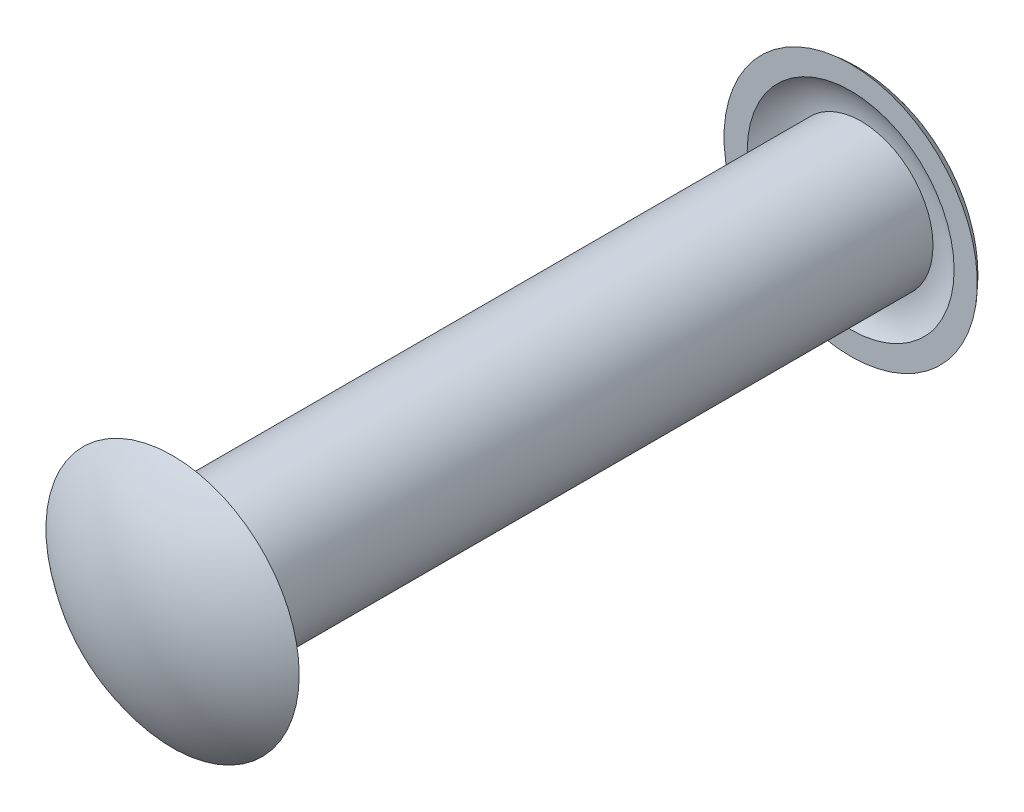
ISO-10303-21;
HEADER;
FILE_DESCRIPTION(('STEP AP214'),'2;1');
FILE_NAME('part.step','',(''),(''),'','','');
FILE_SCHEMA(('AUTOMOTIVE_DESIGN { 1 0 10303 214 1 1 1 1 }'));
ENDSEC;
DATA;
#1=APPLICATION_CONTEXT('core data for automotive mechanical design processes');
#2=APPLICATION_PROTOCOL_DEFINITION('international standard','automotive_design',2000,#1);
#3=PRODUCT_CONTEXT('',#1,'mechanical');
#4=PRODUCT('Part','Part','',(#3));
#5=PRODUCT_RELATED_PRODUCT_CATEGORY('part','',(#4));
#6=PRODUCT_DEFINITION_FORMATION('','',#4);
#7=PRODUCT_DEFINITION_CONTEXT('part definition',#1,'design');
#8=PRODUCT_DEFINITION('design','',#6,#7);
#9=PRODUCT_DEFINITION_SHAPE('','',#8);
#10=(LENGTH_UNIT() NAMED_UNIT(*) SI_UNIT(.MILLI.,.METRE.));
#11=(NAMED_UNIT(*) PLANE_ANGLE_UNIT() SI_UNIT($,.RADIAN.));
#12=(NAMED_UNIT(*) SI_UNIT($,.STERADIAN.) SOLID_ANGLE_UNIT());
#13=UNCERTAINTY_MEASURE_WITH_UNIT(LENGTH_MEASURE(1.E-05),#10,'distance_accuracy_value','');
#14=(GEOMETRIC_REPRESENTATION_CONTEXT(3) GLOBAL_UNCERTAINTY_ASSIGNED_CONTEXT((#13)) GLOBAL_UNIT_ASSIGNED_CONTEXT((#10,
#11,#12)) REPRESENTATION_CONTEXT('',''));
#15=CARTESIAN_POINT('',(0.,0.,0.));
#16=DIRECTION('',(0.,0.,1.));
#17=DIRECTION('',(1.,0.,0.));
#18=AXIS2_PLACEMENT_3D('',#15,#16,#17);
#19=CARTESIAN_POINT('',(0.,0.,0.));
#20=DIRECTION('',(0.,0.,-1.));
#21=DIRECTION('',(0.,1.,0.));
#22=AXIS2_PLACEMENT_3D('',#19,#20,#21);
#23=CONICAL_SURFACE('',#22,0.,0.785398163397349);
#24=CARTESIAN_POINT('',(0.,1.08528637465799E-13,-1.08590399999988));
#25=DIRECTION('',(0.,0.,1.));
#26=DIRECTION('',(0.,-1.,0.));
#27=AXIS2_PLACEMENT_3D('',#24,#25,#26);
#28=CIRCLE('',#27,1.08590399999969);
#29=CARTESIAN_POINT('',(0.,-1.08590399999958,-1.08590399999996));
#30=VERTEX_POINT('',#29);
#31=EDGE_CURVE('E69',#30,#30,#28,.T.);
#32=ORIENTED_EDGE('',*,*,#31,.F.);
#33=EDGE_LOOP('',(#32));
#34=FACE_BOUND('',#33,.T.);
#35=CARTESIAN_POINT('',(0.,0.,0.));
#36=VERTEX_POINT('',#35);
#37=VERTEX_LOOP('',#36);
#38=FACE_BOUND('',#37,.T.);
#39=ADVANCED_FACE('F17',(#34,#38),#23,.F.);
#40=CARTESIAN_POINT('',(0.,1.08528637465799E-13,-1.08590399999988));
#41=DIRECTION('',(0.,0.,-1.));
#42=DIRECTION('',(0.,1.,0.));
#43=AXIS2_PLACEMENT_3D('',#40,#41,#42);
#44=CYLINDRICAL_SURFACE('',#43,1.08590399999969);
#45=ORIENTED_EDGE('',*,*,#31,.T.);
#46=EDGE_LOOP('',(#45));
#47=FACE_BOUND('',#46,.T.);
#48=CARTESIAN_POINT('',(0.,3.13984949151802E-13,-3.45728575391386));
#49=DIRECTION('',(0.,0.,1.));
#50=DIRECTION('',(0.,-1.,0.));
#51=AXIS2_PLACEMENT_3D('',#48,#49,#50);
#52=CIRCLE('',#51,1.08590399999948);
#53=CARTESIAN_POINT('',(0.,1.0859039999998,-3.4572857539138));
#54=VERTEX_POINT('',#53);
#55=EDGE_CURVE('E66',#54,#54,#52,.T.);
#56=ORIENTED_EDGE('',*,*,#55,.F.);
#57=EDGE_LOOP('',(#56));
#58=FACE_BOUND('',#57,.T.);
#59=ADVANCED_FACE('F30',(#47,#58),#44,.F.);
#60=CARTESIAN_POINT('',(0.,1.0859039999998,-3.4572857539138));
#61=CARTESIAN_POINT('',(0.,2.13901754146935,-3.82043926275747));
#62=CARTESIAN_POINT('',(0.,2.82,-2.9554104803391));
#63=CARTESIAN_POINT('',(-1.88084090014134,1.08590399999976,-3.4572857539138));
#64=CARTESIAN_POINT('',(-3.70488706010556,2.1390175414694,-3.82043926275747));
#65=CARTESIAN_POINT('',(-4.8843832773438,2.82,-2.9554104803392));
#66=CARTESIAN_POINT('',(-0.94042045007067,-0.54295199999943,-3.4572857539139));
#67=CARTESIAN_POINT('',(-1.85244353005278,-1.06950877073419,-3.82043926275783));
#68=CARTESIAN_POINT('',(-2.4421916386719,-1.4099999999996,-2.9554104803395));
#69=CARTESIAN_POINT('',(0.,-2.1718079999986,-3.457285753914));
#70=CARTESIAN_POINT('',(0.,-4.27803508293773,-3.82043926275796));
#71=CARTESIAN_POINT('',(0.,-5.6399999999992,-2.9554104803398));
#72=CARTESIAN_POINT('',(0.94042045007067,-0.54295199999943,-3.4572857539139));
#73=CARTESIAN_POINT('',(1.85244353005278,-1.0695087707342,-3.82043926275783));
#74=CARTESIAN_POINT('',(2.4421916386719,-1.4099999999996,-2.9554104803395));
#75=CARTESIAN_POINT('',(1.88084090014134,1.08590399999976,-3.4572857539138));
#76=CARTESIAN_POINT('',(3.70488706010556,2.13901754146938,-3.82043926275747));
#77=CARTESIAN_POINT('',(4.8843832773438,2.82,-2.9554104803392));
#78=CARTESIAN_POINT('',(0.,1.0859039999998,-3.4572857539138));
#79=CARTESIAN_POINT('',(0.,2.13901754146935,-3.82043926275747));
#80=CARTESIAN_POINT('',(0.,2.82,-2.9554104803391));
#81=(BOUNDED_SURFACE() B_SPLINE_SURFACE(2,2,((#60,#61,#62),(#63,#64,#65),(#66,#67,#68),(#69,#70,
#71),(#72,#73,#74),(#75,#76,#77),(#78,#79,#80)),.UNSPECIFIED.,.T.,.F.,
.F.) B_SPLINE_SURFACE_WITH_KNOTS((3,2,2,3),(3,3),(0.,3.1853098575623,6.3706197151245,
9.5559295726868),(0.,1.),
.UNSPECIFIED.) GEOMETRIC_REPRESENTATION_ITEM() RATIONAL_B_SPLINE_SURFACE(((1.,0.81725794790844,
1.),(0.5,0.40862897395422,0.5),(1.,0.81725794790844,1.),(0.5,0.40862897395422,0.5),(1.,
0.81725794790844,1.),(0.5,0.40862897395422,0.5),(1.,0.81725794790844,1.))) REPRESENTATION_ITEM('') SURFACE());
#82=CARTESIAN_POINT('',(0.,2.83117883062475E-13,-2.95541048033947));
#83=DIRECTION('',(0.,0.,1.));
#84=DIRECTION('',(0.,-1.,0.));
#85=AXIS2_PLACEMENT_3D('',#82,#83,#84);
#86=CIRCLE('',#85,2.81999999999956);
#87=CARTESIAN_POINT('',(0.,2.82,-2.9554104803391));
#88=VERTEX_POINT('',#87);
#89=EDGE_CURVE('E21',#88,#88,#86,.T.);
#90=CARTESIAN_POINT('',(0.,1.0859039999998,-3.4572857539138));
#91=CARTESIAN_POINT('',(0.,1.09039277193535,-3.4588336534108));
#92=CARTESIAN_POINT('',(0.,1.09488845956681,-3.46036149850946));
#93=CARTESIAN_POINT('',(0.,1.10390553418825,-3.46338104070194));
#94=CARTESIAN_POINT('',(0.,1.10842695781317,-3.46487262839571));
#95=CARTESIAN_POINT('',(0.,1.11749511283472,-3.46781914733987));
#96=CARTESIAN_POINT('',(0.,1.12204187957727,-3.46927396981157));
#97=CARTESIAN_POINT('',(0.,1.13116031762195,-3.4721464548855));
#98=CARTESIAN_POINT('',(0.,1.13573202298024,-3.47356400938069));
#99=CARTESIAN_POINT('',(0.,1.14489992390877,-3.47636145938025));
#100=CARTESIAN_POINT('',(0.,1.14949615224707,-3.47774124749712));
#101=CARTESIAN_POINT('',(0.,1.15871267356071,-3.48046267047938));
#102=CARTESIAN_POINT('',(0.,1.16333299801853,-3.48180419872561));
#103=CARTESIAN_POINT('',(0.,1.17259727484405,-3.48444861278457));
#104=CARTESIAN_POINT('',(0.,1.17724125741243,-3.48575139279527));
#105=CARTESIAN_POINT('',(0.,1.18655240262039,-3.48831782659022));
#106=CARTESIAN_POINT('',(0.,1.19121959418381,-3.48958137543857));
#107=CARTESIAN_POINT('',(0.,1.20057669849215,-3.4920688687918));
#108=CARTESIAN_POINT('',(0.,1.20526663889029,-3.49329270927593));
#109=CARTESIAN_POINT('',(0.,1.21466877099335,-3.49570031375383));
#110=CARTESIAN_POINT('',(0.,1.21938098908829,-3.49688397469107));
#111=CARTESIAN_POINT('',(0.,1.22882719580065,-3.49921075419115));
#112=CARTESIAN_POINT('',(0.,1.23356120955357,-3.50035377071078));
#113=CARTESIAN_POINT('',(0.,1.24305051597184,-3.50259880204786));
#114=CARTESIAN_POINT('',(0.,1.24780583252811,-3.50370071588445));
#115=CARTESIAN_POINT('',(0.,1.25733724221,-3.50586308937708));
#116=CARTESIAN_POINT('',(0.,1.26211335799315,-3.50692344916353));
#117=CARTESIAN_POINT('',(0.,1.27168585315413,-3.50900226921969));
#118=CARTESIAN_POINT('',(0.,1.27648225396861,-3.51002063077984));
#119=CARTESIAN_POINT('',(0.,1.28609479569633,-3.51201501648138));
#120=CARTESIAN_POINT('',(0.,1.29091095683912,-3.51299094312182));
#121=CARTESIAN_POINT('',(0.,1.30056248532558,-3.51490002880708));
#122=CARTESIAN_POINT('',(0.,1.30539787170673,-3.51583309160789));
#123=CARTESIAN_POINT('',(0.,1.31508730649827,-3.51765602745193));
#124=CARTESIAN_POINT('',(0.,1.31994137277043,-3.51854580555609));
#125=CARTESIAN_POINT('',(0.,1.32966761303568,-3.52028175814775));
#126=CARTESIAN_POINT('',(0.,1.33453980373248,-3.52112783904883));
#127=CARTESIAN_POINT('',(0.,1.34430172854821,-3.52277599196431));
#128=CARTESIAN_POINT('',(0.,1.34919147823171,-3.52357797179221));
#129=CARTESIAN_POINT('',(0.,1.35898794688661,-3.52513752616425));
#130=CARTESIAN_POINT('',(0.,1.36389468030364,-3.52589500996862));
#131=CARTESIAN_POINT('',(0.,1.37372453261999,-3.52736518505079));
#132=CARTESIAN_POINT('',(0.,1.3786476648675,-3.52807778708186));
#133=CARTESIAN_POINT('',(0.,1.38850972154071,-3.52945782080733));
#134=CARTESIAN_POINT('',(0.,1.39344865823995,-3.53012516479383));
#135=CARTESIAN_POINT('',(0.,1.40334172119591,-3.531414314328));
#136=CARTESIAN_POINT('',(0.,1.40829585867554,-3.53203603375175));
#137=CARTESIAN_POINT('',(0.,1.4182187114456,-3.53323357603804));
#138=CARTESIAN_POINT('',(0.,1.42318743693361,-3.5338093144051));
#139=CARTESIAN_POINT('',(0.,1.43313884504718,-3.53491454670325));
#140=CARTESIAN_POINT('',(0.,1.43812153687156,-3.53544395781109));
#141=CARTESIAN_POINT('',(0.,1.44810024826614,-3.53645619822747));
#142=CARTESIAN_POINT('',(0.,1.45309627606417,-3.53693894642798));
#143=CARTESIAN_POINT('',(0.,1.46310102151261,-3.53785753443707));
#144=CARTESIAN_POINT('',(0.,1.46810974644882,-3.53829329489504));
#145=CARTESIAN_POINT('',(0.,1.4781392400036,-3.53911759185165));
#146=CARTESIAN_POINT('',(0.,1.48316001499615,-3.53950605079841));
#147=CARTESIAN_POINT('',(0.,1.4932129544506,-3.5402354404398));
#148=CARTESIAN_POINT('',(0.,1.49824512440601,-3.5405762954217));
#149=CARTESIAN_POINT('',(0.,1.50832019177198,-3.54121018435917));
#150=CARTESIAN_POINT('',(0.,1.51336309382813,-3.54150314448059));
#151=CARTESIAN_POINT('',(0.,1.52345895583011,-3.54204096267974));
#152=CARTESIAN_POINT('',(0.,1.52851191960724,-3.54228574884031));
#153=CARTESIAN_POINT('',(0.,1.53862722819237,-3.5427269500895));
#154=CARTESIAN_POINT('',(0.,1.54368957605212,-3.54292329521529));
#155=CARTESIAN_POINT('',(0.,1.55382296891597,-3.54326735758153));
#156=CARTESIAN_POINT('',(0.,1.55889401622811,-3.54341500684974));
#157=CARTESIAN_POINT('',(0.,1.56904411735572,-3.54366143312163));
#158=CARTESIAN_POINT('',(0.,1.57412317277243,-3.54376014417869));
#159=CARTESIAN_POINT('',(0.,1.58428859299443,-3.54390846229551));
#160=CARTESIAN_POINT('',(0.,1.58937495873201,-3.54395800546816));
#161=CARTESIAN_POINT('',(0.,1.59955429629514,-3.54400776893489));
#162=CARTESIAN_POINT('',(0.,1.60464726842292,-3.54400792743396));
#163=CARTESIAN_POINT('',(0.,1.61483910957479,-3.54395871572133));
#164=CARTESIAN_POINT('',(0.,1.6199379783109,-3.54390928583801));
#165=CARTESIAN_POINT('',(0.,1.63014089789845,-3.54376070476723));
#166=CARTESIAN_POINT('',(0.,1.63524494791241,-3.54366149606151));
#167=CARTESIAN_POINT('',(0.,1.64545750999348,-3.54341317817307));
#168=CARTESIAN_POINT('',(0.,1.65056602071522,-3.54326401365405));
#169=CARTESIAN_POINT('',(0.,1.66078677918293,-3.54291561856008));
#170=CARTESIAN_POINT('',(0.,1.66589902511807,-3.54271633485797));
#171=CARTESIAN_POINT('',(0.,1.67612652433732,-3.54226754957763));
#172=CARTESIAN_POINT('',(0.,1.68124177538839,-3.54201799710707));
#173=CARTESIAN_POINT('',(0.,1.6914745508441,-3.54146853638449));
#174=CARTESIAN_POINT('',(0.,1.69659207263745,-3.54116857949918));
#175=CARTESIAN_POINT('',(0.,1.70682865159383,-3.54051818610347));
#176=CARTESIAN_POINT('',(0.,1.71194770581197,-3.54016770324153));
#177=CARTESIAN_POINT('',(0.,1.7221866079823,-3.53941614824845));
#178=CARTESIAN_POINT('',(0.,1.72730645270133,-3.53901503206864));
#179=CARTESIAN_POINT('',(0.,1.73754619092767,-3.53816211512344));
#180=CARTESIAN_POINT('',(0.,1.74266608095949,-3.53771027263177));
#181=CARTESIAN_POINT('',(0.,1.75290516190169,-3.53675582219279));
#182=CARTESIAN_POINT('',(0.,1.75802434914073,-3.5362531748595));
#183=CARTESIAN_POINT('',(0.,1.76826127397408,-3.53519704842223));
#184=CARTESIAN_POINT('',(0.,1.77337900774819,-3.53464353228884));
#185=CARTESIAN_POINT('',(0.,1.78361227286901,-3.53348561658994));
#186=CARTESIAN_POINT('',(0.,1.78872780029414,-3.5328811823662));
#187=CARTESIAN_POINT('',(0.,1.7989558980328,-3.5316213935673));
#188=CARTESIAN_POINT('',(0.,1.80406846437121,-3.53096600671798));
#189=CARTESIAN_POINT('',(0.,1.81428988371171,-3.52960429056877));
#190=CARTESIAN_POINT('',(0.,1.81939873273333,-3.52889793138999));
#191=CARTESIAN_POINT('',(0.,1.8296119600388,-3.52743426337048));
#192=CARTESIAN_POINT('',(0.,1.83471633438535,-3.52667692705558));
#193=CARTESIAN_POINT('',(0.,1.84491985412885,-3.52511131249717));
#194=CARTESIAN_POINT('',(0.,1.85001899568041,-3.52430300919189));
#195=CARTESIAN_POINT('',(0.,1.86021129118017,-3.522635483377));
#196=CARTESIAN_POINT('',(0.,1.86530444142381,-3.52177623822396));
#197=CARTESIAN_POINT('',(0.,1.87548399558224,-3.52000686646412));
#198=CARTESIAN_POINT('',(0.,1.88057039598235,-3.51909671963641));
#199=CARTESIAN_POINT('',(0.,1.89073569202811,-3.51722559732851));
#200=CARTESIAN_POINT('',(0.,1.89581458439809,-3.51626460405234));
#201=CARTESIAN_POINT('',(0.,1.90596410663037,-3.51429185671304));
#202=CARTESIAN_POINT('',(0.,1.91103473350516,-3.51328008727943));
#203=CARTESIAN_POINT('',(0.,1.92116696803953,-3.51120587055738));
#204=CARTESIAN_POINT('',(0.,1.92622857304886,-3.51014341032278));
#205=CARTESIAN_POINT('',(0.,1.93634200856384,-3.50796790998886));
#206=CARTESIAN_POINT('',(0.,1.94139383680551,-3.5068548593647));
#207=CARTESIAN_POINT('',(0.,1.95148696528911,-3.50457829127996));
#208=CARTESIAN_POINT('',(0.,1.95652826370217,-3.50341476571109));
#209=CARTESIAN_POINT('',(0.,1.96659958119768,-3.5010373757725));
#210=CARTESIAN_POINT('',(0.,1.97162959893501,-3.49982350570446));
#211=CARTESIAN_POINT('',(0.,1.9816776062852,-3.49734556976846));
#212=CARTESIAN_POINT('',(0.,1.98669559508506,-3.49608150060379));
#213=CARTESIAN_POINT('',(0.,1.99671879867406,-3.49350332438761));
#214=CARTESIAN_POINT('',(0.,2.00172401323035,-3.4921892164309));
#215=CARTESIAN_POINT('',(0.,2.01172092572245,-3.48951113539184));
#216=CARTESIAN_POINT('',(0.,2.01671262405322,-3.48814716378388));
#217=CARTESIAN_POINT('',(0.,2.02668176512776,-3.48536954297642));
#218=CARTESIAN_POINT('',(0.,2.03165920894153,-3.48395589761729));
#219=CARTESIAN_POINT('',(0.,2.04159910602324,-3.48107913152847));
#220=CARTESIAN_POINT('',(0.,2.04656156108293,-3.47961601698973));
#221=CARTESIAN_POINT('',(0.,2.05647075006682,-3.47664052935265));
#222=CARTESIAN_POINT('',(0.,2.0614174865507,-3.47512816477874));
#223=CARTESIAN_POINT('',(0.,2.07129451252084,-3.47205440836451));
#224=CARTESIAN_POINT('',(0.,2.07622480538027,-3.47049302736334));
#225=CARTESIAN_POINT('',(0.,2.08606822332172,-3.46732148375178));
#226=CARTESIAN_POINT('',(0.,2.0909813526353,-3.46571133427478));
#227=CARTESIAN_POINT('',(0.,2.10078972813842,-3.46244251360387));
#228=CARTESIAN_POINT('',(0.,2.10568497946211,-3.4607838578155));
#229=CARTESIAN_POINT('',(0.,2.11545688941851,-3.45741829851012));
#230=CARTESIAN_POINT('',(0.,2.12033355413142,-3.45571141264706));
#231=CARTESIAN_POINT('',(0.,2.13006758742098,-3.45224968112712));
#232=CARTESIAN_POINT('',(0.,2.1349249630665,-3.45049485534727));
#233=CARTESIAN_POINT('',(0.,2.14461972123454,-3.44693754571567));
#234=CARTESIAN_POINT('',(0.,2.14945711185639,-3.44513508393713));
#235=CARTESIAN_POINT('',(0.,2.15911120978053,-3.44148281764785));
#236=CARTESIAN_POINT('',(0.,2.16392792625347,-3.43963303737811));
#237=CARTESIAN_POINT('',(0.,2.17353999279936,-3.43588646288485));
#238=CARTESIAN_POINT('',(0.,2.1783353531542,-3.43398969504023));
#239=CARTESIAN_POINT('',(0.,2.18790403181956,-3.43014948742601));
#240=CARTESIAN_POINT('',(0.,2.19267736156214,-3.42820607614184));
#241=CARTESIAN_POINT('',(0.,2.20220131110844,-3.42427293672993));
#242=CARTESIAN_POINT('',(0.,2.20695194353228,-3.42228323916138));
#243=CARTESIAN_POINT('',(0.,2.21642983860345,-3.41825789510809));
#244=CARTESIAN_POINT('',(0.,2.22115711509577,-3.41622228122216));
#245=CARTESIAN_POINT('',(0.,2.2305876468234,-3.41210548509193));
#246=CARTESIAN_POINT('',(0.,2.23529091716425,-3.41002433745061));
#247=CARTESIAN_POINT('',(0.,2.2446727937586,-3.40581686677395));
#248=CARTESIAN_POINT('',(0.,2.24935141641274,-3.40369058030898));
#249=CARTESIAN_POINT('',(0.,2.25868336373917,-3.39939323712371));
#250=CARTESIAN_POINT('',(0.,2.26333670614051,-3.39722221890315));
#251=CARTESIAN_POINT('',(0.,2.27261746828061,-3.39283582927949));
#252=CARTESIAN_POINT('',(0.,2.27724490710896,-3.39062049826633));
#253=CARTESIAN_POINT('',(0.,2.28647324690609,-3.38614591181655));
#254=CARTESIAN_POINT('',(0.,2.29107416835586,-3.38388669861971));
#255=CARTESIAN_POINT('',(0.,2.30024886794443,-3.37932478799266));
#256=CARTESIAN_POINT('',(0.,2.3048226679852,-3.37702213461065));
#257=CARTESIAN_POINT('',(0.,2.3139425293034,-3.37237379497205));
#258=CARTESIAN_POINT('',(0.,2.31848861393203,-3.37002815452958));
#259=CARTESIAN_POINT('',(0.,2.32755245921744,-3.36529430302845));
#260=CARTESIAN_POINT('',(0.,2.33207024470156,-3.36290613950634));
#261=CARTESIAN_POINT('',(0.,2.34107691696935,-3.35808771472832));
#262=CARTESIAN_POINT('',(0.,2.34556583008204,-3.35565750268698));
#263=CARTESIAN_POINT('',(0.,2.35451419358533,-3.35075546409521));
#264=CARTESIAN_POINT('',(0.,2.35897367183078,-3.34828368839205));
#265=CARTESIAN_POINT('',(0.,2.36786261250278,-3.34329901575612));
#266=CARTESIAN_POINT('',(0.,2.37229210433279,-3.34078617125718));
#267=CARTESIAN_POINT('',(0.,2.38112053021053,-3.33571986407098));
#268=CARTESIAN_POINT('',(0.,2.38551949523167,-3.33316645535719));
#269=CARTESIAN_POINT('',(0.,2.39428633686091,-3.32801953224624));
#270=CARTESIAN_POINT('',(0.,2.39865424603223,-3.32542607331453));
#271=CARTESIAN_POINT('',(0.,2.40735845685324,-3.32019957143345));
#272=CARTESIAN_POINT('',(0.,2.41169479267441,-3.31756658539321));
#273=CARTESIAN_POINT('',(0.,2.42033534938857,-3.31226155981413));
#274=CARTESIAN_POINT('',(0.,2.42463960607829,-3.30958957857916));
#275=CARTESIAN_POINT('',(0.,2.43321550899513,-3.30420710167165));
#276=CARTESIAN_POINT('',(0.,2.43748719265975,-3.30149666564822));
#277=CARTESIAN_POINT('',(0.,2.44599746602435,-3.29603782645148));
#278=CARTESIAN_POINT('',(0.,2.45023609481661,-3.29328948422255));
#279=CARTESIAN_POINT('',(0.,2.45867978711713,-3.28775538781061));
#280=CARTESIAN_POINT('',(0.,2.46288489138499,-3.28496969581681));
#281=CARTESIAN_POINT('',(0.,2.47126107564028,-3.27936146265737));
#282=CARTESIAN_POINT('',(0.,2.47543219806569,-3.27653898487495));
#283=CARTESIAN_POINT('',(0.,2.48373997209283,-3.27085775018261));
#284=CARTESIAN_POINT('',(0.,2.4878766678205,-3.26799905779877));
#285=CARTESIAN_POINT('',(0.,2.49611515448225,-3.26224597088334));
#286=CARTESIAN_POINT('',(0.,2.50021699123832,-3.25935164196927));
#287=CARTESIAN_POINT('',(0.,2.50838533867042,-3.2535278655799));
#288=CARTESIAN_POINT('',(0.,2.51245189687109,-3.25059848476189));
#289=CARTESIAN_POINT('',(0.,2.52054927868933,-3.24470519442763));
#290=CARTESIAN_POINT('',(0.,2.52458015153934,-3.24174135255663));
#291=CARTESIAN_POINT('',(0.,2.53260576702658,-3.23577973592424));
#292=CARTESIAN_POINT('',(0.,2.5366005606077,-3.23278202974413));
#293=CARTESIAN_POINT('',(0.,2.54455363488068,-3.22675328591372));
#294=CARTESIAN_POINT('',(0.,2.54851196823011,-3.22372231772874));
#295=CARTESIAN_POINT('',(0.,2.55639175238632,-3.21762765658803));
#296=CARTESIAN_POINT('',(0.,2.56031325756509,-3.21456403392965));
#297=CARTESIAN_POINT('',(0.,2.56811902880956,-3.20840467548738));
#298=CARTESIAN_POINT('',(0.,2.57200335096102,-3.20530901078095));
#299=CARTESIAN_POINT('',(0.,2.5797344127134,-3.19908618450032));
#300=CARTESIAN_POINT('',(0.,2.58358121011177,-3.19595909473184));
#301=CARTESIAN_POINT('',(0.,2.59123689209366,-3.18967403886444));
#302=CARTESIAN_POINT('',(0.,2.59504583618284,-3.18651614524779));
#303=CARTESIAN_POINT('',(0.,2.60262549448562,-3.18017010616877));
#304=CARTESIAN_POINT('',(0.,2.60639626990822,-3.17698203381373));
#305=CARTESIAN_POINT('',(0.,2.61389928704152,-3.17057626535887));
#306=CARTESIAN_POINT('',(0.,2.61763159165833,-3.16735864294017));
#307=CARTESIAN_POINT('',(0.,2.62505737657939,-3.16089440574536));
#308=CARTESIAN_POINT('',(0.,2.6287509214793,-3.15764786517322));
#309=CARTESIAN_POINT('',(0.,2.63609890960348,-3.15112642601716));
#310=CARTESIAN_POINT('',(0.,2.63975341910407,-3.14785160210942));
#311=CARTESIAN_POINT('',(0.,2.64702307229665,-3.14127423325989));
#312=CARTESIAN_POINT('',(0.,2.65063828393547,-3.13797176341626));
#313=CARTESIAN_POINT('',(0.,2.65782909048518,-3.13133974198081));
#314=CARTESIAN_POINT('',(0.,2.66140475500196,-3.12801026585931));
#315=CARTESIAN_POINT('',(0.,2.66851622957639,-3.12132487314068));
#316=CARTESIAN_POINT('',(0.,2.67205211088632,-3.11796903233672));
#317=CARTESIAN_POINT('',(0.,2.67908379446959,-3.1112315531938));
#318=CARTESIAN_POINT('',(0.,2.68257966962773,-3.10784999092202));
#319=CARTESIAN_POINT('',(0.,2.68953112944075,-3.10106171313666));
#320=CARTESIAN_POINT('',(0.,2.69298678859788,-3.09765507391599));
#321=CARTESIAN_POINT('',(0.,2.69985761800154,-3.09081728756636));
#322=CARTESIAN_POINT('',(0.,2.70327286435154,-3.08738621690834));
#323=CARTESIAN_POINT('',(0.,2.71006268273318,-3.08050021374919));
#324=CARTESIAN_POINT('',(0.,2.71343733245218,-3.07704535784997));
#325=CARTESIAN_POINT('',(0.,2.7201457850957,-3.0701124307004));
#326=CARTESIAN_POINT('',(0.,2.72347966727308,-3.06663443613654));
#327=CARTESIAN_POINT('',(0.,2.7301064252132,-3.05965587827571));
#328=CARTESIAN_POINT('',(0.,2.7333993817748,-3.0561553917041));
#329=CARTESIAN_POINT('',(0.,2.73994414163567,-3.04913249627528));
#330=CARTESIAN_POINT('',(0.,2.74319602725934,-3.04561016413732));
#331=CARTESIAN_POINT('',(0.,2.74965851107806,-3.03854422356072));
#332=CARTESIAN_POINT('',(0.,2.75286919310158,-3.03500069179096));
#333=CARTESIAN_POINT('',(0.,2.75924914813732,-3.02789299718599));
#334=CARTESIAN_POINT('',(0.,2.76241850645966,-3.02432891092586));
#335=CARTESIAN_POINT('',(0.,2.76871570498718,-3.01718075154201));
#336=CARTESIAN_POINT('',(0.,2.77184363196079,-3.01359675485694));
#337=CARTESIAN_POINT('',(0.,2.77805787105529,-3.00640941751853));
#338=CARTESIAN_POINT('',(0.,2.78114427137872,-3.00280615312559));
#339=CARTESIAN_POINT('',(0.,2.78727537266811,-2.99558092167217));
#340=CARTESIAN_POINT('',(0.,2.79032016324573,-2.99195903065294));
#341=CARTESIAN_POINT('',(0.,2.79636797272165,-2.98469718544482));
#342=CARTESIAN_POINT('',(0.,2.79937108261474,-2.98105730703786));
#343=CARTESIAN_POINT('',(0.,2.80533547016479,-2.97376012427025));
#344=CARTESIAN_POINT('',(0.,2.80829684017368,-2.97010289539352));
#345=CARTESIAN_POINT('',(0.,2.81417770009184,-2.96277164717393));
#346=CARTESIAN_POINT('',(0.,2.81709728368054,-2.95909770297698));
#347=CARTESIAN_POINT('',(0.,2.82,-2.9554104803391));
#348=B_SPLINE_CURVE_WITH_KNOTS('',3,(#90,#91,#92,#93,#94,#95,#96,#97,#98,#99,#100,#101,#102,
#103,#104,#105,#106,#107,#108,#109,#110,#111,#112,#113,#114,#115,#116,#117,#118,#119,#120,#121,
#122,#123,#124,#125,#126,#127,#128,#129,#130,#131,#132,#133,#134,#135,#136,#137,#138,#139,#140,
#141,#142,#143,#144,#145,#146,#147,#148,#149,#150,#151,#152,#153,#154,#155,#156,#157,#158,#159,
#160,#161,#162,#163,#164,#165,#166,#167,#168,#169,#170,#171,#172,#173,#174,#175,#176,#177,#178,
#179,#180,#181,#182,#183,#184,#185,#186,#187,#188,#189,#190,#191,#192,#193,#194,#195,#196,#197,
#198,#199,#200,#201,#202,#203,#204,#205,#206,#207,#208,#209,#210,#211,#212,#213,#214,#215,#216,
#217,#218,#219,#220,#221,#222,#223,#224,#225,#226,#227,#228,#229,#230,#231,#232,#233,#234,#235,
#236,#237,#238,#239,#240,#241,#242,#243,#244,#245,#246,#247,#248,#249,#250,#251,#252,#253,#254,
#255,#256,#257,#258,#259,#260,#261,#262,#263,#264,#265,#266,#267,#268,#269,#270,#271,#272,#273,
#274,#275,#276,#277,#278,#279,#280,#281,#282,#283,#284,#285,#286,#287,#288,#289,#290,#291,#292,
#293,#294,#295,#296,#297,#298,#299,#300,#301,#302,#303,#304,#305,#306,#307,#308,#309,#310,#311,
#312,#313,#314,#315,#316,#317,#318,#319,#320,#321,#322,#323,#324,#325,#326,#327,#328,#329,#330,
#331,#332,#333,#334,#335,#336,#337,#338,#339,#340,#341,#342,#343,#344,#345,#346,#347),
.UNSPECIFIED.,.F.,.F.,(4,2,2,2,2,2,2,2,2,2,2,2,2,2,2,2,2,2,2,2,2,2,2,2,2,2,2,2,2,2,2,2,2,2,2,2,
2,2,2,2,2,2,2,2,2,2,2,2,2,2,2,2,2,2,2,2,2,2,2,2,2,2,2,2,2,2,2,2,2,2,2,2,2,2,2,2,2,2,2,2,2,2,2,2,
2,2,2,2,2,2,2,2,2,2,2,2,2,2,2,2,2,2,2,2,2,2,2,2,2,2,2,2,2,2,2,2,2,2,2,2,2,2,2,2,2,2,2,2,4),(0.,
0.014244446500647,0.0285275654346793,0.0428489075426213,0.0572080150190483,0.0716044215598282,
0.0860376524138629,0.10050722443935,0.115012646164585,0.129553417853302,0.144129031574589,
0.158738971277341,0.173382712869279,0.18805972430052,0.202769465651687,0.217511389226525,
0.232284939649037,0.247089553965082,0.261924661748421,0.276789685211164,0.291684039318589,
0.306607131908279,0.321558363813529,0.336537128990958,0.351542814652291,0.366574801400212,
0.381632463368237,0.396715168364539,0.411822278019627,0.426953147937801,0.442107127852305,
0.457283561784072,0.472481788203965,0.487701140198428,0.502940945638412,0.518200527351502,
0.533479203297101,0.548776286744573,0.56409108645422,0.579422906860965,0.594771048260623,
0.610134806998618,0.625513475661031,0.640906343267828,0.656312695468138,0.67173181473744,
0.687162980576528,0.702605469712081,0.718058556298738,0.733521512122491,0.748993606805268,
0.764474108010559,0.779962281649932,0.795457392090286,0.810958702361699,0.826465474365717,
0.841976969083933,0.857492446786711,0.8730111672419,0.888532389923402,0.904055374219432,
0.919579379640333,0.9351036660258,0.950627493751375,0.966150123934054,0.981670818636898,
0.997188841072473,1.01270345580502,1.02821392895119,1.04371952837925,1.05921952390658,
1.07471318749541,1.09019979344662,1.10567861859146,1.12114894248116,1.1366100475743,
1.15206121942168,1.16750174684888,1.18293092213607,1.19834804119529,1.21375240374482,
1.22914331348078,1.24452007824575,1.25988201019434,1.27522842595566,1.29055864679264,
1.305871998758,1.32116781284701,1.33644542514676,1.35170417698209,1.36694341505791,
1.38216249159804,1.39736076448045,1.41253759736885,1.42769235984055,1.44282442751072,
1.45793318215279,1.47301801181514,1.48807831093398,1.50311348044244,1.51812292787574,
1.53310606747263,1.54806232027288,1.56299111421097,1.57789188420589,1.59276407224706,
1.60760712747643,1.62242050626668,1.63720367229561,1.6519560966167,1.66667725772582,
1.68136664162417,1.69602374187744,1.7106480596712,1.72523910386259,1.73979639102829,
1.7543194455088,1.76880779944915,1.78326099283593,1.79767857353083,1.81206009730056,
1.82640512784341,1.84071323681225,1.8549840038342,1.86921701652694,1.88341187051168,
1.89756816942293,1.91168552491499,1.92576355666539),.UNSPECIFIED.);
#349=EDGE_CURVE('BSEAM38',#54,#88,#348,.T.);
#350=ORIENTED_EDGE('',*,*,#55,.T.);
#351=ORIENTED_EDGE('',*,*,#89,.F.);
#352=ORIENTED_EDGE('',*,*,#349,.T.);
#353=ORIENTED_EDGE('',*,*,#349,.F.);
#354=EDGE_LOOP('',(#350,#352,#351,#353));
#355=FACE_BOUND('',#354,.T.);
#356=ADVANCED_FACE('F38',(#355),#81,.T.);
#357=CARTESIAN_POINT('',(-3.1019999999997,-3.1019999999995,-2.9554104803393));
#358=DIRECTION('',(0.,0.,1.));
#359=DIRECTION('',(1.,0.,0.));
#360=AXIS2_PLACEMENT_3D('',#357,#358,#359);
#361=PLANE('',#360);
#362=CARTESIAN_POINT('',(0.,1.75423911508169E-13,-2.95541048033947));
#363=DIRECTION('',(0.,0.,1.));
#364=DIRECTION('',(0.,-1.,0.));
#365=AXIS2_PLACEMENT_3D('',#362,#363,#364);
#366=CIRCLE('',#365,2.30367899697166);
#367=CARTESIAN_POINT('',(0.,2.3036789969721,-2.9554104803391));
#368=VERTEX_POINT('',#367);
#369=EDGE_CURVE('E61',#368,#368,#366,.T.);
#370=ORIENTED_EDGE('',*,*,#369,.F.);
#371=EDGE_LOOP('',(#370));
#372=FACE_BOUND('',#371,.T.);
#373=ORIENTED_EDGE('',*,*,#89,.T.);
#374=EDGE_LOOP('',(#373));
#375=FACE_BOUND('',#374,.T.);
#376=ADVANCED_FACE('F76',(#372,#375),#361,.T.);
#377=CARTESIAN_POINT('',(0.,-3.65068136667632E-11,8.75635422544632));
#378=DIRECTION('',(0.,0.,1.));
#379=DIRECTION('',(0.,1.,0.));
#380=AXIS2_PLACEMENT_3D('',#377,#378,#379);
#381=SPHERICAL_SURFACE('',#380,4.40823529421475);
#382=CARTESIAN_POINT('',(-1.39589281368519E-13,-3.64262217575891E-11,12.144589519661));
#383=DIRECTION('',(0.,0.,1.));
#384=DIRECTION('',(1.,0.,0.));
#385=AXIS2_PLACEMENT_3D('',#382,#383,#384);
#386=CIRCLE('',#385,2.82000000003518);
#387=CARTESIAN_POINT('',(2.82000000003504,-3.64262217575891E-11,12.1445895196611));
#388=VERTEX_POINT('',#387);
#389=EDGE_CURVE('E59',#388,#388,#386,.F.);
#390=ORIENTED_EDGE('',*,*,#389,.F.);
#391=EDGE_LOOP('',(#390));
#392=FACE_BOUND('',#391,.T.);
#393=ADVANCED_FACE('F82',(#392),#381,.T.);
#394=CARTESIAN_POINT('',(0.,2.3036789969721,-2.9554104803391));
#395=CARTESIAN_POINT('',(0.,1.98990942316564,-3.1863863143137));
#396=CARTESIAN_POINT('',(0.,1.6,-3.1888144748836));
#397=CARTESIAN_POINT('',(-3.9900890670846,2.3036789969722,-2.9554104803392));
#398=CARTESIAN_POINT('',(-3.44662422338256,1.98990942316566,-3.18638631431377));
#399=CARTESIAN_POINT('',(-2.7712812921098,1.6,-3.1888144748836));
#400=CARTESIAN_POINT('',(-1.9950445335423,-1.1518394984857,-2.9554104803394));
#401=CARTESIAN_POINT('',(-1.7233121116913,-0.99495471158242,-3.18638631431401));
#402=CARTESIAN_POINT('',(-1.3856406460549,-0.79999999999958,-3.1888144748838));
#403=CARTESIAN_POINT('',(0.,-4.6073579939434,-2.9554104803398));
#404=CARTESIAN_POINT('',(0.,-3.97981884633039,-3.18638631431419));
#405=CARTESIAN_POINT('',(0.,-3.1999999999992,-3.188814474884));
#406=CARTESIAN_POINT('',(1.9950445335423,-1.1518394984857,-2.9554104803394));
#407=CARTESIAN_POINT('',(1.7233121116913,-0.99495471158243,-3.18638631431401));
#408=CARTESIAN_POINT('',(1.3856406460549,-0.79999999999958,-3.1888144748838));
#409=CARTESIAN_POINT('',(3.9900890670846,2.3036789969722,-2.9554104803392));
#410=CARTESIAN_POINT('',(3.44662422338256,1.98990942316566,-3.18638631431377));
#411=CARTESIAN_POINT('',(2.7712812921098,1.6,-3.1888144748836));
#412=CARTESIAN_POINT('',(0.,2.3036789969721,-2.9554104803391));
#413=CARTESIAN_POINT('',(0.,1.98990942316564,-3.1863863143137));
#414=CARTESIAN_POINT('',(0.,1.6,-3.1888144748836));
#415=(BOUNDED_SURFACE() B_SPLINE_SURFACE(2,2,((#394,#395,#396),(#397,#398,#399),(#400,#401,
#402),(#403,#404,#405),(#406,#407,#408),(#409,#410,#411),(#412,#413,#414)),.UNSPECIFIED.,.T.,
.F.,.F.) B_SPLINE_SURFACE_WITH_KNOTS((3,2,2,3),(3,3),(0.,8.7560784880962,17.512156976192,
26.268235464289),(0.,1.),
.UNSPECIFIED.) GEOMETRIC_REPRESENTATION_ITEM() RATIONAL_B_SPLINE_SURFACE(((1.,0.95114118809711,
1.),(0.5,0.47557059404856,0.5),(1.,0.95114118809711,1.),(0.5,0.47557059404856,0.5),(1.,
0.95114118809711,1.),(0.5,0.47557059404856,0.5),(1.,0.95114118809711,1.))) REPRESENTATION_ITEM('') SURFACE());
#416=CARTESIAN_POINT('',(0.,3.26615904461258E-13,-3.18881447488374));
#417=DIRECTION('',(0.,0.,1.));
#418=DIRECTION('',(0.,-1.,0.));
#419=AXIS2_PLACEMENT_3D('',#416,#417,#418);
#420=CIRCLE('',#419,1.59999999999973);
#421=CARTESIAN_POINT('',(0.,1.6,-3.1888144748836));
#422=VERTEX_POINT('',#421);
#423=EDGE_CURVE('E25',#422,#422,#420,.T.);
#424=CARTESIAN_POINT('',(0.,2.3036789969721,-2.9554104803391));
#425=CARTESIAN_POINT('',(0.,2.29745217586262,-2.95999425546294));
#426=CARTESIAN_POINT('',(0.,2.29118098053846,-2.96451775022642));
#427=CARTESIAN_POINT('',(0.,2.27853399656958,-2.97345540256915));
#428=CARTESIAN_POINT('',(0.,2.27215795830842,-2.97786920693922));
#429=CARTESIAN_POINT('',(0.,2.25930406415325,-2.98658398573266));
#430=CARTESIAN_POINT('',(0.,2.25282597965677,-2.99088462298112));
#431=CARTESIAN_POINT('',(0.,2.23977092618752,-2.99936967953967));
#432=CARTESIAN_POINT('',(0.,2.23319374930706,-3.00355377896692));
#433=CARTESIAN_POINT('',(0.,2.21994358694393,-3.01180246862879));
#434=CARTESIAN_POINT('',(0.,2.21327041382463,-3.01586675745845));
#435=CARTESIAN_POINT('',(0.,2.19983147637487,-3.0238726432614));
#436=CARTESIAN_POINT('',(0.,2.19306554418992,-3.0278139584708));
#437=CARTESIAN_POINT('',(0.,2.17944444207173,-3.03557082921002));
#438=CARTESIAN_POINT('',(0.,2.17258912350375,-3.03938612373829));
#439=CARTESIAN_POINT('',(0.,2.15879273326653,-3.04688800759542));
#440=CARTESIAN_POINT('',(0.,2.15185153155064,-3.05057435776254));
#441=CARTESIAN_POINT('',(0.,2.13788698524426,-3.05781553648125));
#442=CARTESIAN_POINT('',(0.,2.13086352849586,-3.06137014873853));
#443=CARTESIAN_POINT('',(0.,2.11673820197258,-3.06834517092699));
#444=CARTESIAN_POINT('',(0.,2.10963623716434,-3.0717653884042));
#445=CARTESIAN_POINT('',(0.,2.0953577376055,-3.07846908226677));
#446=CARTESIAN_POINT('',(0.,2.08818112412004,-3.08175239095191));
#447=CARTESIAN_POINT('',(0.,2.07375727676106,-3.08817987629301));
#448=CARTESIAN_POINT('',(0.,2.06650997956668,-3.09132391085184));
#449=CARTESIAN_POINT('',(0.,2.05194881368568,-3.09747061032222));
#450=CARTESIAN_POINT('',(0.,2.04463489615306,-3.10047315952077));
#451=CARTESIAN_POINT('',(0.,2.02994463036972,-3.10633480904668));
#452=CARTESIAN_POINT('',(0.,2.02256824675816,-3.10919382075405));
#453=CARTESIAN_POINT('',(0.,2.00775727369965,-3.11476647910275));
#454=CARTESIAN_POINT('',(0.,2.00032266134127,-3.1174800648503));
#455=CARTESIAN_POINT('',(0.,1.98539953173455,-3.12276012228752));
#456=CARTESIAN_POINT('',(0.,1.97791100294709,-3.12532656136393));
#457=CARTESIAN_POINT('',(0.,1.96288440920066,-3.1303107473639));
#458=CARTESIAN_POINT('',(0.,1.95534634296137,-3.13272849042749));
#459=CARTESIAN_POINT('',(0.,1.94022510230238,-3.13741388040139));
#460=CARTESIAN_POINT('',(0.,1.93264193571649,-3.13968155259397));
#461=CARTESIAN_POINT('',(0.,1.91743497295198,-3.14406557360788));
#462=CARTESIAN_POINT('',(0.,1.90981119255077,-3.14618197715697));
#463=CARTESIAN_POINT('',(0.,1.89452752252366,-3.15026241261567));
#464=CARTESIAN_POINT('',(0.,1.88686765542793,-3.15222652891477));
#465=CARTESIAN_POINT('',(0.,1.87151636524019,-3.15600152219379));
#466=CARTESIAN_POINT('',(0.,1.86382497022554,-3.15781251335326));
#467=CARTESIAN_POINT('',(0.,1.84841520130197,-3.1612805703671));
#468=CARTESIAN_POINT('',(0.,1.84069685980291,-3.16293778023112));
#469=CARTESIAN_POINT('',(0.,1.82523778986947,-3.16609777093135));
#470=CARTESIAN_POINT('',(0.,1.81749709695941,-3.16760072555914));
#471=CARTESIAN_POINT('',(0.,1.80199792201042,-3.17045188436271));
#472=CARTESIAN_POINT('',(0.,1.79423947739441,-3.17180029197623));
#473=CARTESIAN_POINT('',(0.,1.778709393722,-3.17434221712724));
#474=CARTESIAN_POINT('',(0.,1.77093779277905,-3.17553596752629));
#475=CARTESIAN_POINT('',(0.,1.75538597913776,-3.17776861941101));
#476=CARTESIAN_POINT('',(0.,1.74760580404861,-3.17880778287459));
#477=CARTESIAN_POINT('',(0.,1.73204140402598,-3.18073148127481));
#478=CARTESIAN_POINT('',(0.,1.72425721502122,-3.1816163069152));
#479=CARTESIAN_POINT('',(0.,1.70868931968489,-3.18323172734031));
#480=CARTESIAN_POINT('',(0.,1.70090564644908,-3.18396264108318));
#481=CARTESIAN_POINT('',(0.,1.68534327733258,-3.18527080976919));
#482=CARTESIAN_POINT('',(0.,1.67756461059083,-3.18584841137631));
#483=CARTESIAN_POINT('',(0.,1.66201670309975,-3.18685070061794));
#484=CARTESIAN_POINT('',(0.,1.65424748644197,-3.18727576199561));
#485=CARTESIAN_POINT('',(0.,1.63872287367544,-3.1879738797724));
#486=CARTESIAN_POINT('',(0.,1.63096749555809,-3.18824733630903));
#487=CARTESIAN_POINT('',(0.,1.61547489284828,-3.18864333283802));
#488=CARTESIAN_POINT('',(0.,1.6077376791356,-3.18876629855788));
#489=CARTESIAN_POINT('',(0.,1.6,-3.1888144748836));
#490=B_SPLINE_CURVE_WITH_KNOTS('',3,(#424,#425,#426,#427,#428,#429,#430,#431,#432,#433,#434,
#435,#436,#437,#438,#439,#440,#441,#442,#443,#444,#445,#446,#447,#448,#449,#450,#451,#452,#453,
#454,#455,#456,#457,#458,#459,#460,#461,#462,#463,#464,#465,#466,#467,#468,#469,#470,#471,#472,
#473,#474,#475,#476,#477,#478,#479,#480,#481,#482,#483,#484,#485,#486,#487,#488,#489),
.UNSPECIFIED.,.F.,.F.,(4,2,2,2,2,2,2,2,2,2,2,2,2,2,2,2,2,2,2,2,2,2,2,2,2,2,2,2,2,2,2,2,4),(0.,
0.0231957297225714,0.0464583999077257,0.0697839401382295,0.093168210466646,0.116607005420834,
0.140096058186687,0.16363104495883,0.187207589449145,0.21082126754218,0.234467612085813,
0.258142117804733,0.281840246323781,0.305557431287504,0.329289083561826,0.353030596503268,
0.376777351280776,0.400524722234937,0.424268082259145,0.448002808187125,0.471724286171232,
0.495427917035914,0.519109121590899,0.542763345888844,0.566386066412486,0.589972795176683,
0.613519084731187,0.637020533050503,0.660472788297757,0.683871553450168,0.707212590774376,
0.730491726140694,0.753704853166087),.UNSPECIFIED.);
#491=EDGE_CURVE('BSEAM50',#368,#422,#490,.T.);
#492=ORIENTED_EDGE('',*,*,#369,.T.);
#493=ORIENTED_EDGE('',*,*,#423,.F.);
#494=ORIENTED_EDGE('',*,*,#491,.T.);
#495=ORIENTED_EDGE('',*,*,#491,.F.);
#496=EDGE_LOOP('',(#492,#494,#493,#495));
#497=FACE_BOUND('',#496,.T.);
#498=ADVANCED_FACE('F50',(#497),#415,.T.);
#499=CARTESIAN_POINT('',(-3.1019999999999,3.1019999999988,12.144589519661));
#500=DIRECTION('',(0.,0.,-1.));
#501=DIRECTION('',(1.,0.,0.));
#502=AXIS2_PLACEMENT_3D('',#499,#500,#501);
#503=PLANE('',#502);
#504=CARTESIAN_POINT('',(0.,-9.5347135957017E-13,12.1445895196609));
#505=DIRECTION('',(0.,0.,1.));
#506=DIRECTION('',(0.,-1.,0.));
#507=AXIS2_PLACEMENT_3D('',#504,#505,#506);
#508=CIRCLE('',#507,1.59999999999973);
#509=CARTESIAN_POINT('',(0.,-1.60000000000068,12.1445895196607));
#510=VERTEX_POINT('',#509);
#511=EDGE_CURVE('E11',#510,#510,#508,.F.);
#512=ORIENTED_EDGE('',*,*,#511,.F.);
#513=EDGE_LOOP('',(#512));
#514=FACE_BOUND('',#513,.T.);
#515=ORIENTED_EDGE('',*,*,#389,.T.);
#516=EDGE_LOOP('',(#515));
#517=FACE_BOUND('',#516,.T.);
#518=ADVANCED_FACE('F44',(#514,#517),#503,.T.);
#519=CARTESIAN_POINT('',(0.,3.26615904461258E-13,-3.18881447488374));
#520=DIRECTION('',(0.,0.,1.));
#521=DIRECTION('',(0.,-1.,0.));
#522=AXIS2_PLACEMENT_3D('',#519,#520,#521);
#523=CYLINDRICAL_SURFACE('',#522,1.59999999999973);
#524=ORIENTED_EDGE('',*,*,#423,.T.);
#525=EDGE_LOOP('',(#524));
#526=FACE_BOUND('',#525,.T.);
#527=ORIENTED_EDGE('',*,*,#511,.T.);
#528=EDGE_LOOP('',(#527));
#529=FACE_BOUND('',#528,.T.);
#530=ADVANCED_FACE('F19',(#526,#529),#523,.T.);
#531=CLOSED_SHELL('',(#39,#59,#356,#376,#393,#498,#518,#530));
#532=MANIFOLD_SOLID_BREP('B1',#531);
#533=ADVANCED_BREP_SHAPE_REPRESENTATION('',(#18,#532),#14);
#534=SHAPE_DEFINITION_REPRESENTATION(#9,#533);
ENDSEC;
END-ISO-10303-21;
